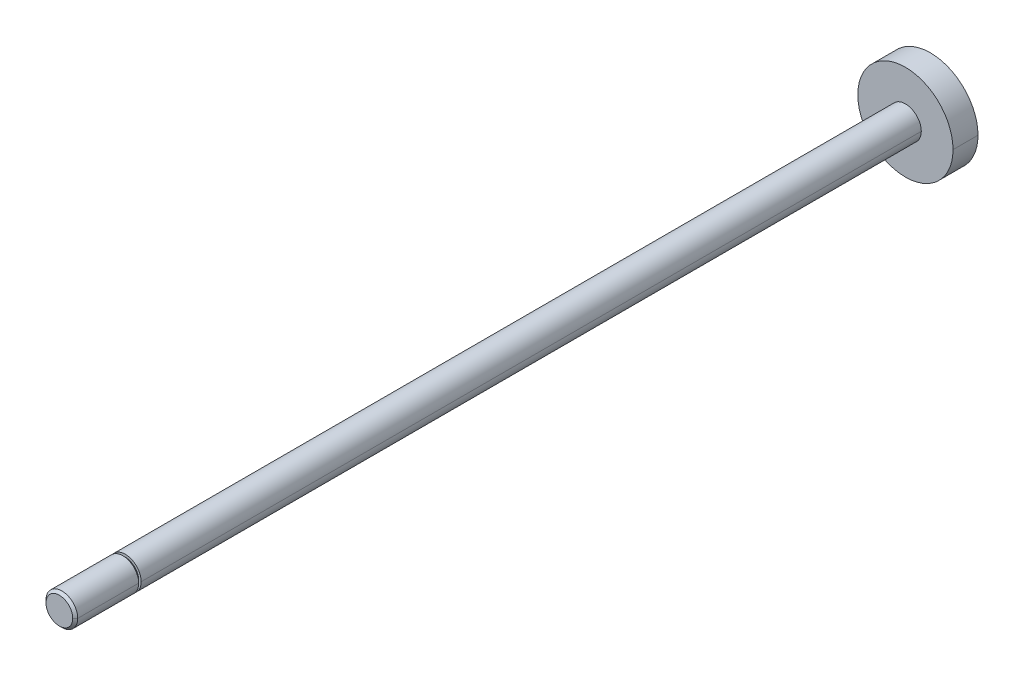
ISO-10303-21;
HEADER;
FILE_DESCRIPTION(('STEP AP214'),'2;1');
FILE_NAME('part.step','',(''),(''),'','','');
FILE_SCHEMA(('AUTOMOTIVE_DESIGN { 1 0 10303 214 1 1 1 1 }'));
ENDSEC;
DATA;
#1=APPLICATION_CONTEXT('core data for automotive mechanical design processes');
#2=APPLICATION_PROTOCOL_DEFINITION('international standard','automotive_design',2000,#1);
#3=PRODUCT_CONTEXT('',#1,'mechanical');
#4=PRODUCT('Part','Part','',(#3));
#5=PRODUCT_RELATED_PRODUCT_CATEGORY('part','',(#4));
#6=PRODUCT_DEFINITION_FORMATION('','',#4);
#7=PRODUCT_DEFINITION_CONTEXT('part definition',#1,'design');
#8=PRODUCT_DEFINITION('design','',#6,#7);
#9=PRODUCT_DEFINITION_SHAPE('','',#8);
#10=(LENGTH_UNIT() NAMED_UNIT(*) SI_UNIT(.MILLI.,.METRE.));
#11=(NAMED_UNIT(*) PLANE_ANGLE_UNIT() SI_UNIT($,.RADIAN.));
#12=(NAMED_UNIT(*) SI_UNIT($,.STERADIAN.) SOLID_ANGLE_UNIT());
#13=UNCERTAINTY_MEASURE_WITH_UNIT(LENGTH_MEASURE(1.E-05),#10,'distance_accuracy_value','');
#14=(GEOMETRIC_REPRESENTATION_CONTEXT(3) GLOBAL_UNCERTAINTY_ASSIGNED_CONTEXT((#13)) GLOBAL_UNIT_ASSIGNED_CONTEXT((#10,
#11,#12)) REPRESENTATION_CONTEXT('',''));
#15=CARTESIAN_POINT('',(0.,0.,0.));
#16=DIRECTION('',(0.,0.,1.));
#17=DIRECTION('',(1.,0.,0.));
#18=AXIS2_PLACEMENT_3D('',#15,#16,#17);
#19=CARTESIAN_POINT('',(0.,0.,171.831));
#20=DIRECTION('',(0.,0.,-1.));
#21=DIRECTION('',(0.,-1.,0.));
#22=AXIS2_PLACEMENT_3D('',#19,#20,#21);
#23=PLANE('',#22);
#24=CARTESIAN_POINT('',(0.,0.,171.831));
#25=DIRECTION('',(0.,0.,-1.));
#26=DIRECTION('',(-1.,0.,0.));
#27=AXIS2_PLACEMENT_3D('',#24,#25,#26);
#28=CIRCLE('',#27,2.675);
#29=CARTESIAN_POINT('',(-2.675,0.,171.831));
#30=VERTEX_POINT('',#29);
#31=CARTESIAN_POINT('',(2.675,0.,171.831));
#32=VERTEX_POINT('',#31);
#33=EDGE_CURVE('E173',#30,#32,#28,.T.);
#34=ORIENTED_EDGE('',*,*,#33,.F.);
#35=CARTESIAN_POINT('',(0.,0.,171.831));
#36=DIRECTION('',(0.,0.,-1.));
#37=DIRECTION('',(-1.,0.,0.));
#38=AXIS2_PLACEMENT_3D('',#35,#36,#37);
#39=CIRCLE('',#38,2.675);
#40=EDGE_CURVE('E11',#32,#30,#39,.T.);
#41=ORIENTED_EDGE('',*,*,#40,.F.);
#42=EDGE_LOOP('',(#34,#41));
#43=FACE_BOUND('',#42,.T.);
#44=ADVANCED_FACE('F17',(#43),#23,.F.);
#45=CARTESIAN_POINT('',(0.,0.,171.831));
#46=DIRECTION('',(0.,0.,-1.));
#47=DIRECTION('',(-1.,0.,0.));
#48=AXIS2_PLACEMENT_3D('',#45,#46,#47);
#49=CONICAL_SURFACE('',#48,2.675,0.785398163397452);
#50=DIRECTION('',(0.70710678118655,0.,-0.707106781186545));
#51=VECTOR('',#50,1.);
#52=CARTESIAN_POINT('',(2.675,0.,171.831));
#53=LINE('',#52,#51);
#54=CARTESIAN_POINT('',(3.175,0.,171.331));
#55=VERTEX_POINT('',#54);
#56=EDGE_CURVE('E176',#32,#55,#53,.T.);
#57=ORIENTED_EDGE('',*,*,#56,.F.);
#58=ORIENTED_EDGE('',*,*,#40,.T.);
#59=DIRECTION('',(-0.70710678118655,0.,-0.707106781186545));
#60=VECTOR('',#59,1.);
#61=CARTESIAN_POINT('',(-2.675,0.,171.831));
#62=LINE('',#61,#60);
#63=CARTESIAN_POINT('',(-3.175,0.,171.331));
#64=VERTEX_POINT('',#63);
#65=EDGE_CURVE('E189',#30,#64,#62,.T.);
#66=ORIENTED_EDGE('',*,*,#65,.T.);
#67=CARTESIAN_POINT('',(0.,0.,171.331));
#68=DIRECTION('',(0.,0.,-1.));
#69=DIRECTION('',(-1.,0.,0.));
#70=AXIS2_PLACEMENT_3D('',#67,#68,#69);
#71=CIRCLE('',#70,3.175);
#72=EDGE_CURVE('E28',#55,#64,#71,.T.);
#73=ORIENTED_EDGE('',*,*,#72,.F.);
#74=EDGE_LOOP('',(#57,#58,#66,#73));
#75=FACE_BOUND('',#74,.T.);
#76=ADVANCED_FACE('F226',(#75),#49,.T.);
#77=CARTESIAN_POINT('',(0.,0.,180.811256121069));
#78=DIRECTION('',(0.,0.,-1.));
#79=DIRECTION('',(-1.,0.,0.));
#80=AXIS2_PLACEMENT_3D('',#77,#78,#79);
#81=CYLINDRICAL_SURFACE('',#80,3.175);
#82=DIRECTION('',(0.,0.,-1.));
#83=VECTOR('',#82,1.);
#84=CARTESIAN_POINT('',(3.175,0.,180.811256121069));
#85=LINE('',#84,#83);
#86=CARTESIAN_POINT('',(3.175,0.,159.131));
#87=VERTEX_POINT('',#86);
#88=EDGE_CURVE('E172',#55,#87,#85,.T.);
#89=ORIENTED_EDGE('',*,*,#88,.F.);
#90=ORIENTED_EDGE('',*,*,#72,.T.);
#91=DIRECTION('',(0.,0.,-1.));
#92=VECTOR('',#91,1.);
#93=CARTESIAN_POINT('',(-3.175,0.,180.811256121069));
#94=LINE('',#93,#92);
#95=CARTESIAN_POINT('',(-3.175,0.,159.131));
#96=VERTEX_POINT('',#95);
#97=EDGE_CURVE('E156',#64,#96,#94,.T.);
#98=ORIENTED_EDGE('',*,*,#97,.T.);
#99=CARTESIAN_POINT('',(0.,0.,159.131));
#100=DIRECTION('',(0.,0.,-1.));
#101=DIRECTION('',(-1.,0.,0.));
#102=AXIS2_PLACEMENT_3D('',#99,#100,#101);
#103=CIRCLE('',#102,3.175);
#104=EDGE_CURVE('E144',#87,#96,#103,.T.);
#105=ORIENTED_EDGE('',*,*,#104,.F.);
#106=EDGE_LOOP('',(#89,#90,#98,#105));
#107=FACE_BOUND('',#106,.T.);
#108=ADVANCED_FACE('F232',(#107),#81,.T.);
#109=CARTESIAN_POINT('',(0.,0.,0.));
#110=DIRECTION('',(0.,0.,-1.));
#111=DIRECTION('',(-1.,0.,0.));
#112=AXIS2_PLACEMENT_3D('',#109,#110,#111);
#113=CYLINDRICAL_SURFACE('',#112,2.675);
#114=DIRECTION('',(0.,0.,-1.));
#115=VECTOR('',#114,1.);
#116=CARTESIAN_POINT('',(2.675,0.,0.));
#117=LINE('',#116,#115);
#118=CARTESIAN_POINT('',(2.675,0.,159.131));
#119=VERTEX_POINT('',#118);
#120=CARTESIAN_POINT('',(2.675,0.,158.631));
#121=VERTEX_POINT('',#120);
#122=EDGE_CURVE('E139',#119,#121,#117,.T.);
#123=ORIENTED_EDGE('',*,*,#122,.F.);
#124=CARTESIAN_POINT('',(0.,0.,159.131));
#125=DIRECTION('',(0.,0.,-1.));
#126=DIRECTION('',(-1.,0.,0.));
#127=AXIS2_PLACEMENT_3D('',#124,#125,#126);
#128=CIRCLE('',#127,2.675);
#129=CARTESIAN_POINT('',(-2.675,0.,159.131));
#130=VERTEX_POINT('',#129);
#131=EDGE_CURVE('E133',#119,#130,#128,.T.);
#132=ORIENTED_EDGE('',*,*,#131,.T.);
#133=DIRECTION('',(0.,0.,-1.));
#134=VECTOR('',#133,1.);
#135=CARTESIAN_POINT('',(-2.675,0.,0.));
#136=LINE('',#135,#134);
#137=CARTESIAN_POINT('',(-2.675,0.,158.631));
#138=VERTEX_POINT('',#137);
#139=EDGE_CURVE('E136',#130,#138,#136,.T.);
#140=ORIENTED_EDGE('',*,*,#139,.T.);
#141=CARTESIAN_POINT('',(0.,0.,158.631));
#142=DIRECTION('',(0.,0.,-1.));
#143=DIRECTION('',(-1.,0.,0.));
#144=AXIS2_PLACEMENT_3D('',#141,#142,#143);
#145=CIRCLE('',#144,2.675);
#146=EDGE_CURVE('E293',#121,#138,#145,.T.);
#147=ORIENTED_EDGE('',*,*,#146,.F.);
#148=EDGE_LOOP('',(#123,#132,#140,#147));
#149=FACE_BOUND('',#148,.T.);
#150=ADVANCED_FACE('F135',(#149),#113,.T.);
#151=CARTESIAN_POINT('',(0.,3.175,159.131));
#152=DIRECTION('',(0.,0.,1.));
#153=DIRECTION('',(1.,0.,0.));
#154=AXIS2_PLACEMENT_3D('',#151,#152,#153);
#155=PLANE('',#154);
#156=CARTESIAN_POINT('',(0.,0.,159.131));
#157=DIRECTION('',(0.,0.,-1.));
#158=DIRECTION('',(-1.,0.,0.));
#159=AXIS2_PLACEMENT_3D('',#156,#157,#158);
#160=CIRCLE('',#159,2.675);
#161=EDGE_CURVE('E148',#130,#119,#160,.T.);
#162=ORIENTED_EDGE('',*,*,#161,.F.);
#163=ORIENTED_EDGE('',*,*,#131,.F.);
#164=EDGE_LOOP('',(#162,#163));
#165=FACE_BOUND('',#164,.T.);
#166=CARTESIAN_POINT('',(0.,0.,159.131));
#167=DIRECTION('',(0.,0.,-1.));
#168=DIRECTION('',(-1.,0.,0.));
#169=AXIS2_PLACEMENT_3D('',#166,#167,#168);
#170=CIRCLE('',#169,3.175);
#171=EDGE_CURVE('E165',#96,#87,#170,.T.);
#172=ORIENTED_EDGE('',*,*,#171,.T.);
#173=ORIENTED_EDGE('',*,*,#104,.T.);
#174=EDGE_LOOP('',(#172,#173));
#175=FACE_BOUND('',#174,.T.);
#176=ADVANCED_FACE('F153',(#165,#175),#155,.F.);
#177=CARTESIAN_POINT('',(0.,2.675,158.631));
#178=DIRECTION('',(0.,0.,-1.));
#179=DIRECTION('',(0.,-1.,0.));
#180=AXIS2_PLACEMENT_3D('',#177,#178,#179);
#181=PLANE('',#180);
#182=CARTESIAN_POINT('',(0.,0.,158.631));
#183=DIRECTION('',(0.,0.,-1.));
#184=DIRECTION('',(-1.,0.,0.));
#185=AXIS2_PLACEMENT_3D('',#182,#183,#184);
#186=CIRCLE('',#185,2.675);
#187=EDGE_CURVE('E21',#138,#121,#186,.T.);
#188=ORIENTED_EDGE('',*,*,#187,.T.);
#189=ORIENTED_EDGE('',*,*,#146,.T.);
#190=EDGE_LOOP('',(#188,#189));
#191=FACE_BOUND('',#190,.T.);
#192=CARTESIAN_POINT('',(0.,0.,158.631));
#193=DIRECTION('',(0.,0.,-1.));
#194=DIRECTION('',(-1.,0.,0.));
#195=AXIS2_PLACEMENT_3D('',#192,#193,#194);
#196=CIRCLE('',#195,3.175);
#197=CARTESIAN_POINT('',(-3.175,0.,158.631));
#198=VERTEX_POINT('',#197);
#199=CARTESIAN_POINT('',(3.175,0.,158.631));
#200=VERTEX_POINT('',#199);
#201=EDGE_CURVE('E151',#198,#200,#196,.T.);
#202=ORIENTED_EDGE('',*,*,#201,.F.);
#203=CARTESIAN_POINT('',(0.,0.,158.631));
#204=DIRECTION('',(0.,0.,-1.));
#205=DIRECTION('',(-1.,0.,0.));
#206=AXIS2_PLACEMENT_3D('',#203,#204,#205);
#207=CIRCLE('',#206,3.175);
#208=EDGE_CURVE('E102',#200,#198,#207,.T.);
#209=ORIENTED_EDGE('',*,*,#208,.F.);
#210=EDGE_LOOP('',(#202,#209));
#211=FACE_BOUND('',#210,.T.);
#212=ADVANCED_FACE('F19',(#191,#211),#181,.F.);
#213=CARTESIAN_POINT('',(0.,0.,180.811256121069));
#214=DIRECTION('',(0.,0.,-1.));
#215=DIRECTION('',(-1.,0.,0.));
#216=AXIS2_PLACEMENT_3D('',#213,#214,#215);
#217=CYLINDRICAL_SURFACE('',#216,3.175);
#218=DIRECTION('',(0.,0.,-1.));
#219=VECTOR('',#218,1.);
#220=CARTESIAN_POINT('',(3.175,0.,180.811256121069));
#221=LINE('',#220,#219);
#222=CARTESIAN_POINT('',(3.175,0.,2.5));
#223=VERTEX_POINT('',#222);
#224=EDGE_CURVE('E201',#200,#223,#221,.T.);
#225=ORIENTED_EDGE('',*,*,#224,.F.);
#226=ORIENTED_EDGE('',*,*,#208,.T.);
#227=DIRECTION('',(0.,0.,-1.));
#228=VECTOR('',#227,1.);
#229=CARTESIAN_POINT('',(-3.175,0.,180.811256121069));
#230=LINE('',#229,#228);
#231=CARTESIAN_POINT('',(-3.175,0.,2.5));
#232=VERTEX_POINT('',#231);
#233=EDGE_CURVE('E200',#198,#232,#230,.T.);
#234=ORIENTED_EDGE('',*,*,#233,.T.);
#235=CARTESIAN_POINT('',(0.,0.,2.5));
#236=DIRECTION('',(0.,0.,1.));
#237=DIRECTION('',(1.,0.,0.));
#238=AXIS2_PLACEMENT_3D('',#235,#236,#237);
#239=CIRCLE('',#238,3.175);
#240=EDGE_CURVE('E117',#232,#223,#239,.T.);
#241=ORIENTED_EDGE('',*,*,#240,.T.);
#242=EDGE_LOOP('',(#225,#226,#234,#241));
#243=FACE_BOUND('',#242,.T.);
#244=ADVANCED_FACE('F214',(#243),#217,.T.);
#245=CARTESIAN_POINT('',(0.,0.,-2.5));
#246=DIRECTION('',(0.,0.,1.));
#247=DIRECTION('',(1.,0.,0.));
#248=AXIS2_PLACEMENT_3D('',#245,#246,#247);
#249=PLANE('',#248);
#250=CARTESIAN_POINT('',(0.,0.,-2.5));
#251=DIRECTION('',(0.,0.,1.));
#252=DIRECTION('',(1.,0.,0.));
#253=AXIS2_PLACEMENT_3D('',#250,#251,#252);
#254=CIRCLE('',#253,9.525);
#255=CARTESIAN_POINT('',(-9.525,0.,-2.5));
#256=VERTEX_POINT('',#255);
#257=CARTESIAN_POINT('',(9.525,0.,-2.5));
#258=VERTEX_POINT('',#257);
#259=EDGE_CURVE('E42',#256,#258,#254,.T.);
#260=ORIENTED_EDGE('',*,*,#259,.F.);
#261=CARTESIAN_POINT('',(0.,0.,-2.5));
#262=DIRECTION('',(0.,0.,1.));
#263=DIRECTION('',(1.,0.,0.));
#264=AXIS2_PLACEMENT_3D('',#261,#262,#263);
#265=CIRCLE('',#264,9.525);
#266=EDGE_CURVE('E264',#258,#256,#265,.T.);
#267=ORIENTED_EDGE('',*,*,#266,.F.);
#268=EDGE_LOOP('',(#260,#267));
#269=FACE_BOUND('',#268,.T.);
#270=ADVANCED_FACE('F222',(#269),#249,.F.);
#271=CARTESIAN_POINT('',(0.,0.,2.5));
#272=DIRECTION('',(0.,0.,-1.));
#273=DIRECTION('',(-1.,0.,0.));
#274=AXIS2_PLACEMENT_3D('',#271,#272,#273);
#275=CYLINDRICAL_SURFACE('',#274,9.525);
#276=DIRECTION('',(0.,0.,-1.));
#277=VECTOR('',#276,1.);
#278=CARTESIAN_POINT('',(9.525,0.,2.5));
#279=LINE('',#278,#277);
#280=CARTESIAN_POINT('',(9.525,0.,2.5));
#281=VERTEX_POINT('',#280);
#282=EDGE_CURVE('E258',#281,#258,#279,.T.);
#283=ORIENTED_EDGE('',*,*,#282,.F.);
#284=CARTESIAN_POINT('',(0.,0.,2.5));
#285=DIRECTION('',(0.,0.,1.));
#286=DIRECTION('',(1.,0.,0.));
#287=AXIS2_PLACEMENT_3D('',#284,#285,#286);
#288=CIRCLE('',#287,9.525);
#289=CARTESIAN_POINT('',(-9.525,0.,2.5));
#290=VERTEX_POINT('',#289);
#291=EDGE_CURVE('E260',#290,#281,#288,.T.);
#292=ORIENTED_EDGE('',*,*,#291,.F.);
#293=DIRECTION('',(0.,0.,-1.));
#294=VECTOR('',#293,1.);
#295=CARTESIAN_POINT('',(-9.525,0.,2.5));
#296=LINE('',#295,#294);
#297=EDGE_CURVE('E268',#290,#256,#296,.T.);
#298=ORIENTED_EDGE('',*,*,#297,.T.);
#299=ORIENTED_EDGE('',*,*,#259,.T.);
#300=EDGE_LOOP('',(#283,#292,#298,#299));
#301=FACE_BOUND('',#300,.T.);
#302=ADVANCED_FACE('F242',(#301),#275,.T.);
#303=CARTESIAN_POINT('',(0.,0.,2.5));
#304=DIRECTION('',(0.,0.,1.));
#305=DIRECTION('',(1.,0.,0.));
#306=AXIS2_PLACEMENT_3D('',#303,#304,#305);
#307=PLANE('',#306);
#308=ORIENTED_EDGE('',*,*,#240,.F.);
#309=CARTESIAN_POINT('',(0.,0.,2.5));
#310=DIRECTION('',(0.,0.,1.));
#311=DIRECTION('',(1.,0.,0.));
#312=AXIS2_PLACEMENT_3D('',#309,#310,#311);
#313=CIRCLE('',#312,3.175);
#314=EDGE_CURVE('E196',#223,#232,#313,.T.);
#315=ORIENTED_EDGE('',*,*,#314,.F.);
#316=EDGE_LOOP('',(#308,#315));
#317=FACE_BOUND('',#316,.T.);
#318=ORIENTED_EDGE('',*,*,#291,.T.);
#319=CARTESIAN_POINT('',(0.,0.,2.5));
#320=DIRECTION('',(0.,0.,1.));
#321=DIRECTION('',(1.,0.,0.));
#322=AXIS2_PLACEMENT_3D('',#319,#320,#321);
#323=CIRCLE('',#322,9.525);
#324=EDGE_CURVE('E265',#281,#290,#323,.T.);
#325=ORIENTED_EDGE('',*,*,#324,.T.);
#326=EDGE_LOOP('',(#318,#325));
#327=FACE_BOUND('',#326,.T.);
#328=ADVANCED_FACE('F246',(#317,#327),#307,.T.);
#329=CARTESIAN_POINT('',(0.,0.,2.5));
#330=DIRECTION('',(0.,0.,-1.));
#331=DIRECTION('',(-1.,0.,0.));
#332=AXIS2_PLACEMENT_3D('',#329,#330,#331);
#333=CYLINDRICAL_SURFACE('',#332,9.525);
#334=ORIENTED_EDGE('',*,*,#324,.F.);
#335=ORIENTED_EDGE('',*,*,#282,.T.);
#336=ORIENTED_EDGE('',*,*,#266,.T.);
#337=ORIENTED_EDGE('',*,*,#297,.F.);
#338=EDGE_LOOP('',(#334,#335,#336,#337));
#339=FACE_BOUND('',#338,.T.);
#340=ADVANCED_FACE('F239',(#339),#333,.T.);
#341=CARTESIAN_POINT('',(0.,0.,180.811256121069));
#342=DIRECTION('',(0.,0.,-1.));
#343=DIRECTION('',(-1.,0.,0.));
#344=AXIS2_PLACEMENT_3D('',#341,#342,#343);
#345=CYLINDRICAL_SURFACE('',#344,3.175);
#346=ORIENTED_EDGE('',*,*,#201,.T.);
#347=ORIENTED_EDGE('',*,*,#224,.T.);
#348=ORIENTED_EDGE('',*,*,#314,.T.);
#349=ORIENTED_EDGE('',*,*,#233,.F.);
#350=EDGE_LOOP('',(#346,#347,#348,#349));
#351=FACE_BOUND('',#350,.T.);
#352=ADVANCED_FACE('F212',(#351),#345,.T.);
#353=CARTESIAN_POINT('',(0.,0.,0.));
#354=DIRECTION('',(0.,0.,-1.));
#355=DIRECTION('',(-1.,0.,0.));
#356=AXIS2_PLACEMENT_3D('',#353,#354,#355);
#357=CYLINDRICAL_SURFACE('',#356,2.675);
#358=ORIENTED_EDGE('',*,*,#161,.T.);
#359=ORIENTED_EDGE('',*,*,#122,.T.);
#360=ORIENTED_EDGE('',*,*,#187,.F.);
#361=ORIENTED_EDGE('',*,*,#139,.F.);
#362=EDGE_LOOP('',(#358,#359,#360,#361));
#363=FACE_BOUND('',#362,.T.);
#364=ADVANCED_FACE('F147',(#363),#357,.T.);
#365=CARTESIAN_POINT('',(0.,0.,180.811256121069));
#366=DIRECTION('',(0.,0.,-1.));
#367=DIRECTION('',(-1.,0.,0.));
#368=AXIS2_PLACEMENT_3D('',#365,#366,#367);
#369=CYLINDRICAL_SURFACE('',#368,3.175);
#370=CARTESIAN_POINT('',(0.,0.,171.331));
#371=DIRECTION('',(0.,0.,-1.));
#372=DIRECTION('',(-1.,0.,0.));
#373=AXIS2_PLACEMENT_3D('',#370,#371,#372);
#374=CIRCLE('',#373,3.175);
#375=EDGE_CURVE('E182',#64,#55,#374,.T.);
#376=ORIENTED_EDGE('',*,*,#375,.T.);
#377=ORIENTED_EDGE('',*,*,#88,.T.);
#378=ORIENTED_EDGE('',*,*,#171,.F.);
#379=ORIENTED_EDGE('',*,*,#97,.F.);
#380=EDGE_LOOP('',(#376,#377,#378,#379));
#381=FACE_BOUND('',#380,.T.);
#382=ADVANCED_FACE('F409',(#381),#369,.T.);
#383=CARTESIAN_POINT('',(0.,0.,171.831));
#384=DIRECTION('',(0.,0.,-1.));
#385=DIRECTION('',(-1.,0.,0.));
#386=AXIS2_PLACEMENT_3D('',#383,#384,#385);
#387=CONICAL_SURFACE('',#386,2.675,0.785398163397452);
#388=ORIENTED_EDGE('',*,*,#33,.T.);
#389=ORIENTED_EDGE('',*,*,#56,.T.);
#390=ORIENTED_EDGE('',*,*,#375,.F.);
#391=ORIENTED_EDGE('',*,*,#65,.F.);
#392=EDGE_LOOP('',(#388,#389,#390,#391));
#393=FACE_BOUND('',#392,.T.);
#394=ADVANCED_FACE('F405',(#393),#387,.T.);
#395=CLOSED_SHELL('',(#44,#76,#108,#150,#176,#212,#244,#270,#302,#328,#340,#352,#364,#382,#394));
#396=MANIFOLD_SOLID_BREP('B1',#395);
#397=ADVANCED_BREP_SHAPE_REPRESENTATION('',(#18,#396),#14);
#398=SHAPE_DEFINITION_REPRESENTATION(#9,#397);
ENDSEC;
END-ISO-10303-21;
